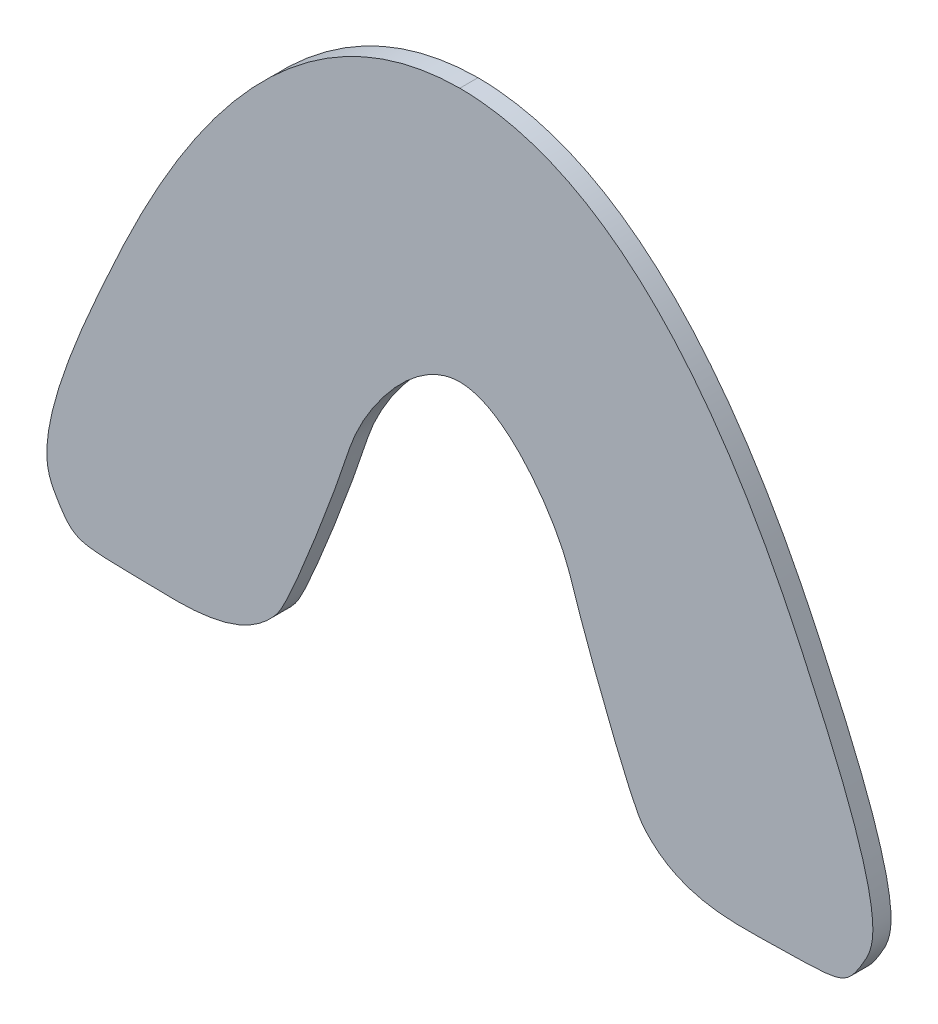
ISO-10303-21;
HEADER;
FILE_DESCRIPTION(('STEP AP214'),'2;1');
FILE_NAME('part.step','',(''),(''),'','','');
FILE_SCHEMA(('AUTOMOTIVE_DESIGN { 1 0 10303 214 1 1 1 1 }'));
ENDSEC;
DATA;
#1=APPLICATION_CONTEXT('core data for automotive mechanical design processes');
#2=APPLICATION_PROTOCOL_DEFINITION('international standard','automotive_design',2000,#1);
#3=PRODUCT_CONTEXT('',#1,'mechanical');
#4=PRODUCT('Part','Part','',(#3));
#5=PRODUCT_RELATED_PRODUCT_CATEGORY('part','',(#4));
#6=PRODUCT_DEFINITION_FORMATION('','',#4);
#7=PRODUCT_DEFINITION_CONTEXT('part definition',#1,'design');
#8=PRODUCT_DEFINITION('design','',#6,#7);
#9=PRODUCT_DEFINITION_SHAPE('','',#8);
#10=(LENGTH_UNIT() NAMED_UNIT(*) SI_UNIT(.MILLI.,.METRE.));
#11=(NAMED_UNIT(*) PLANE_ANGLE_UNIT() SI_UNIT($,.RADIAN.));
#12=(NAMED_UNIT(*) SI_UNIT($,.STERADIAN.) SOLID_ANGLE_UNIT());
#13=UNCERTAINTY_MEASURE_WITH_UNIT(LENGTH_MEASURE(1.E-05),#10,'distance_accuracy_value','');
#14=(GEOMETRIC_REPRESENTATION_CONTEXT(3) GLOBAL_UNCERTAINTY_ASSIGNED_CONTEXT((#13)) GLOBAL_UNIT_ASSIGNED_CONTEXT((#10,
#11,#12)) REPRESENTATION_CONTEXT('',''));
#15=CARTESIAN_POINT('',(0.,0.,0.));
#16=DIRECTION('',(0.,0.,1.));
#17=DIRECTION('',(1.,0.,0.));
#18=AXIS2_PLACEMENT_3D('',#15,#16,#17);
#19=CARTESIAN_POINT('',(0.,40.,2.));
#20=CARTESIAN_POINT('',(-21.5644538083649,39.8587884123847,2.));
#21=CARTESIAN_POINT('',(-36.4301411047986,8.03734057536328,2.));
#22=CARTESIAN_POINT('',(-42.8673742319119,-6.42785131526692,2.));
#23=CARTESIAN_POINT('',(-46.7345255031981,-17.1188004739198,2.));
#24=CARTESIAN_POINT('',(-42.4848366724459,-24.5674738718792,2.));
#25=CARTESIAN_POINT('',(-41.7578449824923,-24.1851696633757,2.));
#26=CARTESIAN_POINT('',(-24.932153146029,-24.683236686302,2.));
#27=CARTESIAN_POINT('',(-21.3142250163809,-21.6453867478818,2.));
#28=CARTESIAN_POINT('',(-18.945566804108,-18.7638871481818,2.));
#29=CARTESIAN_POINT('',(-13.6514852006402,-5.28112036996456,2.));
#30=CARTESIAN_POINT('',(-10.8518217860423,3.83648954861966,2.));
#31=CARTESIAN_POINT('',(-4.76161901423359,11.999995668675,2.));
#32=CARTESIAN_POINT('',(0.,12.,2.));
#33=B_SPLINE_CURVE_WITH_KNOTS('',3,(#19,#20,#21,#22,#23,#24,#25,#26,#27,#28,#29,#30,#31,#32),
.UNSPECIFIED.,.F.,.F.,(4,1,1,1,1,1,1,1,1,1,1,4),(0.303894497040815,0.387984842881098,
0.405679150977278,0.472486641666464,0.492615608779038,0.586839854990443,0.606946211197903,
0.673572814646177,0.689035748833461,0.746112618883458,0.758311954579723,0.803894497039859),.UNSPECIFIED.);
#34=DIRECTION('',(0.,0.,-1.));
#35=VECTOR('',#34,1.);
#36=SURFACE_OF_LINEAR_EXTRUSION('',#33,#35);
#37=CARTESIAN_POINT('',(0.,40.,0.));
#38=CARTESIAN_POINT('',(-21.5644538083649,39.8587884123847,0.));
#39=CARTESIAN_POINT('',(-36.4301411047986,8.03734057536328,0.));
#40=CARTESIAN_POINT('',(-42.8673742319119,-6.42785131526692,0.));
#41=CARTESIAN_POINT('',(-46.7345255031981,-17.1188004739198,0.));
#42=CARTESIAN_POINT('',(-42.4848366724459,-24.5674738718792,0.));
#43=CARTESIAN_POINT('',(-41.7578449824923,-24.1851696633757,0.));
#44=CARTESIAN_POINT('',(-24.932153146029,-24.683236686302,0.));
#45=CARTESIAN_POINT('',(-21.3142250163809,-21.6453867478818,0.));
#46=CARTESIAN_POINT('',(-18.945566804108,-18.7638871481818,0.));
#47=CARTESIAN_POINT('',(-13.6514852006402,-5.28112036996456,0.));
#48=CARTESIAN_POINT('',(-10.8518217860423,3.83648954861966,0.));
#49=CARTESIAN_POINT('',(-4.76161901423359,11.999995668675,0.));
#50=CARTESIAN_POINT('',(0.,12.,0.));
#51=B_SPLINE_CURVE_WITH_KNOTS('',3,(#37,#38,#39,#40,#41,#42,#43,#44,#45,#46,#47,#48,#49,#50),
.UNSPECIFIED.,.F.,.F.,(4,1,1,1,1,1,1,1,1,1,1,4),(0.303894497040815,0.387984842881098,
0.405679150977278,0.472486641666464,0.492615608779038,0.586839854990443,0.606946211197903,
0.673572814646177,0.689035748833461,0.746112618883458,0.758311954579723,0.803894497039859),.UNSPECIFIED.);
#52=CARTESIAN_POINT('',(0.,40.,0.));
#53=VERTEX_POINT('',#52);
#54=CARTESIAN_POINT('',(0.,12.,0.));
#55=VERTEX_POINT('',#54);
#56=EDGE_CURVE('E72',#53,#55,#51,.T.);
#57=ORIENTED_EDGE('',*,*,#56,.T.);
#58=DIRECTION('',(0.,0.,-1.));
#59=VECTOR('',#58,1.);
#60=CARTESIAN_POINT('',(0.,12.,2.));
#61=LINE('',#60,#59);
#62=CARTESIAN_POINT('',(0.,12.,2.));
#63=VERTEX_POINT('',#62);
#64=EDGE_CURVE('E11',#63,#55,#61,.T.);
#65=ORIENTED_EDGE('',*,*,#64,.F.);
#66=CARTESIAN_POINT('',(0.,40.,2.));
#67=VERTEX_POINT('',#66);
#68=EDGE_CURVE('E71',#67,#63,#33,.T.);
#69=ORIENTED_EDGE('',*,*,#68,.F.);
#70=DIRECTION('',(0.,0.,-1.));
#71=VECTOR('',#70,1.);
#72=CARTESIAN_POINT('',(0.,40.,2.));
#73=LINE('',#72,#71);
#74=EDGE_CURVE('E48',#67,#53,#73,.T.);
#75=ORIENTED_EDGE('',*,*,#74,.T.);
#76=EDGE_LOOP('',(#57,#65,#69,#75));
#77=FACE_BOUND('',#76,.T.);
#78=ADVANCED_FACE('F38',(#77),#36,.F.);
#79=CARTESIAN_POINT('',(0.,12.,2.));
#80=CARTESIAN_POINT('',(4.76161901423359,11.999995668675,2.));
#81=CARTESIAN_POINT('',(10.8518217860423,3.83648954861966,2.));
#82=CARTESIAN_POINT('',(13.6514852006402,-5.28112036996456,2.));
#83=CARTESIAN_POINT('',(18.945566804108,-18.7638871481818,2.));
#84=CARTESIAN_POINT('',(21.3142250163809,-21.6453867478818,2.));
#85=CARTESIAN_POINT('',(24.932153146029,-24.683236686302,2.));
#86=CARTESIAN_POINT('',(41.7578449824923,-24.1851696633757,2.));
#87=CARTESIAN_POINT('',(42.4848366724459,-24.5674738718792,2.));
#88=CARTESIAN_POINT('',(46.7345255031981,-17.1188004739198,2.));
#89=CARTESIAN_POINT('',(42.8673742319119,-6.42785131526692,2.));
#90=CARTESIAN_POINT('',(36.4301411047986,8.03734057536328,2.));
#91=CARTESIAN_POINT('',(21.5644538083649,39.8587884123847,2.));
#92=CARTESIAN_POINT('',(0.,40.,2.));
#93=B_SPLINE_CURVE_WITH_KNOTS('',3,(#79,#80,#81,#82,#83,#84,#85,#86,#87,#88,#89,#90,#91,#92),
.UNSPECIFIED.,.F.,.F.,(4,1,1,1,1,1,1,1,1,1,1,4),(0.303894497040815,0.349477039500951,
0.361676375197216,0.418753245247213,0.434216179434497,0.500842782882771,0.520949139090231,
0.615173385301636,0.63530235241421,0.702109843103396,0.719804151199576,0.803894497039859),.UNSPECIFIED.);
#94=DIRECTION('',(0.,0.,-1.));
#95=VECTOR('',#94,1.);
#96=SURFACE_OF_LINEAR_EXTRUSION('',#93,#95);
#97=CARTESIAN_POINT('',(0.,12.,0.));
#98=CARTESIAN_POINT('',(4.76161901423359,11.999995668675,0.));
#99=CARTESIAN_POINT('',(10.8518217860423,3.83648954861966,0.));
#100=CARTESIAN_POINT('',(13.6514852006402,-5.28112036996456,0.));
#101=CARTESIAN_POINT('',(18.945566804108,-18.7638871481818,0.));
#102=CARTESIAN_POINT('',(21.3142250163809,-21.6453867478818,0.));
#103=CARTESIAN_POINT('',(24.932153146029,-24.683236686302,0.));
#104=CARTESIAN_POINT('',(41.7578449824923,-24.1851696633757,0.));
#105=CARTESIAN_POINT('',(42.4848366724459,-24.5674738718792,0.));
#106=CARTESIAN_POINT('',(46.7345255031981,-17.1188004739198,0.));
#107=CARTESIAN_POINT('',(42.8673742319119,-6.42785131526692,0.));
#108=CARTESIAN_POINT('',(36.4301411047986,8.03734057536328,0.));
#109=CARTESIAN_POINT('',(21.5644538083649,39.8587884123847,0.));
#110=CARTESIAN_POINT('',(0.,40.,0.));
#111=B_SPLINE_CURVE_WITH_KNOTS('',3,(#97,#98,#99,#100,#101,#102,#103,#104,#105,#106,#107,#108,
#109,#110),.UNSPECIFIED.,.F.,.F.,(4,1,1,1,1,1,1,1,1,1,1,4),(0.303894497040815,0.349477039500951,
0.361676375197216,0.418753245247213,0.434216179434497,0.500842782882771,0.520949139090231,
0.615173385301636,0.63530235241421,0.702109843103396,0.719804151199576,0.803894497039859),.UNSPECIFIED.);
#112=EDGE_CURVE('E63',#55,#53,#111,.T.);
#113=ORIENTED_EDGE('',*,*,#112,.T.);
#114=ORIENTED_EDGE('',*,*,#74,.F.);
#115=EDGE_CURVE('E55',#63,#67,#93,.T.);
#116=ORIENTED_EDGE('',*,*,#115,.F.);
#117=ORIENTED_EDGE('',*,*,#64,.T.);
#118=EDGE_LOOP('',(#113,#114,#116,#117));
#119=FACE_BOUND('',#118,.T.);
#120=ADVANCED_FACE('F66',(#119),#96,.F.);
#121=CARTESIAN_POINT('',(-40.0807726181934,-24.229085061938,2.));
#122=DIRECTION('',(0.,0.,-1.));
#123=DIRECTION('',(-1.,0.,0.));
#124=AXIS2_PLACEMENT_3D('',#121,#122,#123);
#125=PLANE('',#124);
#126=ORIENTED_EDGE('',*,*,#68,.T.);
#127=ORIENTED_EDGE('',*,*,#115,.T.);
#128=EDGE_LOOP('',(#126,#127));
#129=FACE_BOUND('',#128,.T.);
#130=ADVANCED_FACE('F102',(#129),#125,.F.);
#131=CARTESIAN_POINT('',(-40.0807726181934,-24.229085061938,0.));
#132=DIRECTION('',(0.,0.,-1.));
#133=DIRECTION('',(-1.,0.,0.));
#134=AXIS2_PLACEMENT_3D('',#131,#132,#133);
#135=PLANE('',#134);
#136=ORIENTED_EDGE('',*,*,#56,.F.);
#137=ORIENTED_EDGE('',*,*,#112,.F.);
#138=EDGE_LOOP('',(#136,#137));
#139=FACE_BOUND('',#138,.T.);
#140=ADVANCED_FACE('F76',(#139),#135,.T.);
#141=CLOSED_SHELL('',(#78,#120,#130,#140));
#142=MANIFOLD_SOLID_BREP('B2',#141);
#143=ADVANCED_BREP_SHAPE_REPRESENTATION('',(#18,#142),#14);
#144=SHAPE_DEFINITION_REPRESENTATION(#9,#143);
ENDSEC;
END-ISO-10303-21;
